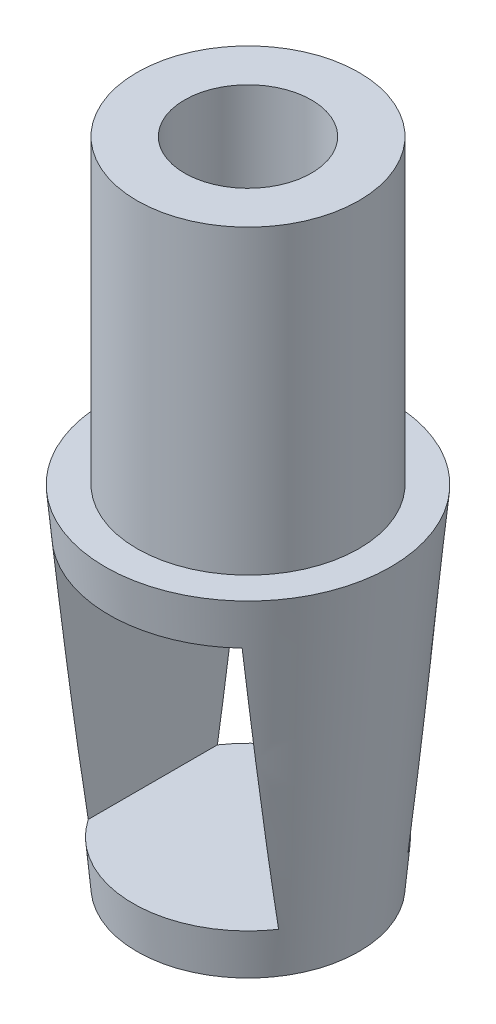
ISO-10303-21;
HEADER;
FILE_DESCRIPTION(('STEP AP214'),'2;1');
FILE_NAME('part.step','',(''),(''),'','','');
FILE_SCHEMA(('AUTOMOTIVE_DESIGN { 1 0 10303 214 1 1 1 1 }'));
ENDSEC;
DATA;
#1=APPLICATION_CONTEXT('core data for automotive mechanical design processes');
#2=APPLICATION_PROTOCOL_DEFINITION('international standard','automotive_design',2000,#1);
#3=PRODUCT_CONTEXT('',#1,'mechanical');
#4=PRODUCT('Part','Part','',(#3));
#5=PRODUCT_RELATED_PRODUCT_CATEGORY('part','',(#4));
#6=PRODUCT_DEFINITION_FORMATION('','',#4);
#7=PRODUCT_DEFINITION_CONTEXT('part definition',#1,'design');
#8=PRODUCT_DEFINITION('design','',#6,#7);
#9=PRODUCT_DEFINITION_SHAPE('','',#8);
#10=(LENGTH_UNIT() NAMED_UNIT(*) SI_UNIT(.MILLI.,.METRE.));
#11=(NAMED_UNIT(*) PLANE_ANGLE_UNIT() SI_UNIT($,.RADIAN.));
#12=(NAMED_UNIT(*) SI_UNIT($,.STERADIAN.) SOLID_ANGLE_UNIT());
#13=UNCERTAINTY_MEASURE_WITH_UNIT(LENGTH_MEASURE(1.E-05),#10,'distance_accuracy_value','');
#14=(GEOMETRIC_REPRESENTATION_CONTEXT(3) GLOBAL_UNCERTAINTY_ASSIGNED_CONTEXT((#13)) GLOBAL_UNIT_ASSIGNED_CONTEXT((#10,
#11,#12)) REPRESENTATION_CONTEXT('',''));
#15=CARTESIAN_POINT('',(0.,0.,0.));
#16=DIRECTION('',(0.,0.,1.));
#17=DIRECTION('',(1.,0.,0.));
#18=AXIS2_PLACEMENT_3D('',#15,#16,#17);
#19=CARTESIAN_POINT('',(0.,-22.,0.));
#20=DIRECTION('',(0.,1.,0.));
#21=DIRECTION('',(-1.,0.,0.));
#22=AXIS2_PLACEMENT_3D('',#19,#20,#21);
#23=PLANE('',#22);
#24=CARTESIAN_POINT('',(0.,-22.,0.));
#25=DIRECTION('',(0.,1.,0.));
#26=DIRECTION('',(-1.,0.,0.));
#27=AXIS2_PLACEMENT_3D('',#24,#25,#26);
#28=CIRCLE('',#27,7.);
#29=CARTESIAN_POINT('',(-7.,-22.,0.));
#30=VERTEX_POINT('',#29);
#31=EDGE_CURVE('E113',#30,#30,#28,.T.);
#32=ORIENTED_EDGE('',*,*,#31,.F.);
#33=EDGE_LOOP('',(#32));
#34=FACE_BOUND('',#33,.T.);
#35=ADVANCED_FACE('F39',(#34),#23,.F.);
#36=CARTESIAN_POINT('',(0.,-22.,0.));
#37=DIRECTION('',(0.,1.,0.));
#38=DIRECTION('',(-1.,0.,0.));
#39=AXIS2_PLACEMENT_3D('',#36,#37,#38);
#40=CONICAL_SURFACE('',#39,7.,0.0906598872007452);
#41=CARTESIAN_POINT('',(0.,-19.25,0.));
#42=DIRECTION('',(0.,-1.,0.));
#43=DIRECTION('',(0.,0.,-1.));
#44=AXIS2_PLACEMENT_3D('',#41,#42,#43);
#45=CIRCLE('',#44,7.25);
#46=CARTESIAN_POINT('',(-6.,-19.25,-4.06970514902493));
#47=VERTEX_POINT('',#46);
#48=CARTESIAN_POINT('',(6.,-19.25,-4.06970514902493));
#49=VERTEX_POINT('',#48);
#50=EDGE_CURVE('E52',#47,#49,#45,.T.);
#51=ORIENTED_EDGE('',*,*,#50,.T.);
#52=CARTESIAN_POINT('',(6.,-2.74929999999999,6.36895702924845));
#53=CARTESIAN_POINT('',(6.,-3.41157786192484,6.28623613697593));
#54=CARTESIAN_POINT('',(6.,-4.0737639269837,6.20277903288443));
#55=CARTESIAN_POINT('',(6.,-5.3979240031515,6.03418044636888));
#56=CARTESIAN_POINT('',(6.,-6.05989801346312,5.94903895768528));
#57=CARTESIAN_POINT('',(6.,-8.04559694126963,5.69075204212243));
#58=CARTESIAN_POINT('',(6.,-9.36895359432704,5.51476220239234));
#59=CARTESIAN_POINT('',(6.,-12.019282568322,5.15213850487161));
#60=CARTESIAN_POINT('',(6.,-13.346249803363,4.96546715528971));
#61=CARTESIAN_POINT('',(6.,-15.3351355936867,4.67497056708737));
#62=CARTESIAN_POINT('',(6.,-15.9978202457844,4.57639268817128));
#63=CARTESIAN_POINT('',(6.,-17.3225413479327,4.37498344986034));
#64=CARTESIAN_POINT('',(6.,-17.9845778013007,4.27215211235177));
#65=CARTESIAN_POINT('',(6.,-19.3072785696448,4.06134468215654));
#66=CARTESIAN_POINT('',(6.,-19.967943564382,3.95337287288708));
#67=CARTESIAN_POINT('',(6.,-21.2881968069699,3.73080510320076));
#68=CARTESIAN_POINT('',(6.,-21.9477849955678,3.61620879010885));
#69=CARTESIAN_POINT('',(6.,-23.2643888672432,3.37854709283215));
#70=CARTESIAN_POINT('',(6.,-23.9214069589679,3.25549521152295));
#71=CARTESIAN_POINT('',(6.,-24.9051342942861,3.06195112518811));
#72=CARTESIAN_POINT('',(6.,-25.2327260668337,2.99594580059214));
#73=CARTESIAN_POINT('',(6.,-25.8871543084975,2.86030009997771));
#74=CARTESIAN_POINT('',(6.,-26.2139907892526,2.79065978036928));
#75=CARTESIAN_POINT('',(6.,-26.8667004631996,2.64689409351386));
#76=CARTESIAN_POINT('',(6.,-27.1925735971368,2.57276845616035));
#77=CARTESIAN_POINT('',(6.,-27.8430478823879,2.41880587155663));
#78=CARTESIAN_POINT('',(6.,-28.1676487691075,2.33896779651065));
#79=CARTESIAN_POINT('',(6.,-28.8159728483708,2.17145995649624));
#80=CARTESIAN_POINT('',(6.,-29.1396896337184,2.08376527473112));
#81=CARTESIAN_POINT('',(6.,-29.7839860933867,1.8978286991293));
#82=CARTESIAN_POINT('',(6.00000000000001,-30.1045672686348,1.79959215113137));
#83=CARTESIAN_POINT('',(6.00000000000001,-30.5821914672678,1.63967118885288));
#84=CARTESIAN_POINT('',(6.00000000000001,-30.7412761235643,1.58410552032572));
#85=CARTESIAN_POINT('',(6.00000000000001,-31.0575918871342,1.46744653213443));
#86=CARTESIAN_POINT('',(6.00000000000001,-31.2148213039651,1.406348554146));
#87=CARTESIAN_POINT('',(6.00000000000001,-31.5253338429986,1.27697251772333));
#88=CARTESIAN_POINT('',(6.00000000000001,-31.67863345847,1.20873421101269));
#89=CARTESIAN_POINT('',(6.00000000000001,-31.9799074744141,1.06149636613106));
#90=CARTESIAN_POINT('',(6.00000000000001,-32.127891075645,0.982516677906375));
#91=CARTESIAN_POINT('',(6.00000000000001,-32.3383078650953,0.852720628920309));
#92=CARTESIAN_POINT('',(6.00000000000001,-32.4049627108245,0.808812198958892));
#93=CARTESIAN_POINT('',(6.00000000000001,-32.5344726282563,0.715410606815345));
#94=CARTESIAN_POINT('',(6.00000000000001,-32.5973235558198,0.665911516360918));
#95=CARTESIAN_POINT('',(6.00000000000001,-32.7029342276362,0.571384954380518));
#96=CARTESIAN_POINT('',(6.00000000000001,-32.7470278475958,0.527867688824986));
#97=CARTESIAN_POINT('',(6.00000000000001,-32.8286888686916,0.435042864570852));
#98=CARTESIAN_POINT('',(6.00000000000001,-32.866276337585,0.385753926329013));
#99=CARTESIAN_POINT('',(6.00000000000001,-32.9169770114221,0.302569984290009));
#100=CARTESIAN_POINT('',(6.00000000000001,-32.9337334237531,0.270924390627975));
#101=CARTESIAN_POINT('',(6.00000000000001,-32.9622928455412,0.205458990699502));
#102=CARTESIAN_POINT('',(6.00000000000001,-32.9741024599122,0.171642153523508));
#103=CARTESIAN_POINT('',(6.00000000000001,-32.9915853917568,0.101986499656772));
#104=CARTESIAN_POINT('',(6.00000000000001,-32.997186343342,0.0661288565779811));
#105=CARTESIAN_POINT('',(6.00000000000001,-33.0011557792697,-0.00598557723448762));
#106=CARTESIAN_POINT('',(6.00000000000001,-32.9995282067407,-0.0422421395942278));
#107=CARTESIAN_POINT('',(6.00000000000001,-32.9900016346548,-0.108971249552611));
#108=CARTESIAN_POINT('',(6.00000000000001,-32.9829622119818,-0.139573627735668));
#109=CARTESIAN_POINT('',(6.00000000000001,-32.9643932967254,-0.199371226856132));
#110=CARTESIAN_POINT('',(6.00000000000001,-32.9528607125466,-0.228565463320849));
#111=CARTESIAN_POINT('',(6.00000000000001,-32.9178285633561,-0.303025976250943));
#112=CARTESIAN_POINT('',(6.00000000000001,-32.8913607235488,-0.346882220532207));
#113=CARTESIAN_POINT('',(6.00000000000001,-32.8321916863204,-0.430157060314446));
#114=CARTESIAN_POINT('',(6.00000000000001,-32.7994701746349,-0.469560508684157));
#115=CARTESIAN_POINT('',(6.00000000000001,-32.7205586737434,-0.554752707799295));
#116=CARTESIAN_POINT('',(6.00000000000001,-32.6731239632975,-0.599370571702481));
#117=CARTESIAN_POINT('',(6.00000000000001,-32.5742084619371,-0.683932070191172));
#118=CARTESIAN_POINT('',(6.00000000000001,-32.5227198440629,-0.723866272766231));
#119=CARTESIAN_POINT('',(6.00000000000001,-32.4168282994722,-0.800275135265663));
#120=CARTESIAN_POINT('',(6.00000000000001,-32.3624107507736,-0.836729308745305));
#121=CARTESIAN_POINT('',(6.00000000000001,-32.2517934453364,-0.906665602261655));
#122=CARTESIAN_POINT('',(6.00000000000001,-32.1955954546985,-0.940150549609554));
#123=CARTESIAN_POINT('',(6.00000000000001,-32.027502401997,-1.03568589608355));
#124=CARTESIAN_POINT('',(6.00000000000001,-31.9137359320747,-1.09443243330031));
#125=CARTESIAN_POINT('',(6.00000000000001,-31.683191532179,-1.20573985987264));
#126=CARTESIAN_POINT('',(6.00000000000001,-31.5664114658135,-1.25829620536914));
#127=CARTESIAN_POINT('',(6.00000000000001,-31.3306223148068,-1.35889344684933));
#128=CARTESIAN_POINT('',(6.00000000000001,-31.2116087944306,-1.40692388450964));
#129=CARTESIAN_POINT('',(6.00000000000001,-30.9721848586101,-1.49938431393649));
#130=CARTESIAN_POINT('',(6.00000000000001,-30.8517742422687,-1.5438137803746));
#131=CARTESIAN_POINT('',(6.00000000000001,-30.4886298636029,-1.67295772576053));
#132=CARTESIAN_POINT('',(6.00000000000001,-30.2443690289647,-1.75336979857048));
#133=CARTESIAN_POINT('',(6.00000000000001,-29.7538159174057,-1.90621625434781));
#134=CARTESIAN_POINT('',(6.,-29.5075272221107,-1.97866238056993));
#135=CARTESIAN_POINT('',(6.,-29.016060319094,-2.11696085795093));
#136=CARTESIAN_POINT('',(6.,-28.7709001009231,-2.18287744042156));
#137=CARTESIAN_POINT('',(6.,-28.2794308416723,-2.31028468314236));
#138=CARTESIAN_POINT('',(6.,-28.0331217557226,-2.37177516896068));
#139=CARTESIAN_POINT('',(6.,-27.292825502795,-2.55098933758772));
#140=CARTESIAN_POINT('',(6.,-26.7975613135171,-2.66343066917876));
#141=CARTESIAN_POINT('',(6.,-25.8043537795619,-2.87874650657173));
#142=CARTESIAN_POINT('',(6.,-25.3064078832079,-2.98160903727526));
#143=CARTESIAN_POINT('',(6.,-24.3091351195651,-3.18008754912198));
#144=CARTESIAN_POINT('',(6.,-23.8098084051278,-3.27570430148908));
#145=CARTESIAN_POINT('',(6.,-22.8111951199479,-3.46114428114212));
#146=CARTESIAN_POINT('',(6.,-22.3119107634498,-3.5509795031266));
#147=CARTESIAN_POINT('',(6.,-21.3125483920742,-3.72618256137088));
#148=CARTESIAN_POINT('',(6.,-20.8124703569143,-3.81155028150715));
#149=CARTESIAN_POINT('',(6.,-19.3119099528939,-4.06209896602684));
#150=CARTESIAN_POINT('',(6.,-18.3105187875108,-4.22183143877735));
#151=CARTESIAN_POINT('',(6.,-16.0979128486086,-4.56314810496472));
#152=CARTESIAN_POINT('',(6.,-14.8863381490878,-4.74237559396403));
#153=CARTESIAN_POINT('',(6.,-12.4614046431944,-5.09018663846466));
#154=CARTESIAN_POINT('',(6.,-11.2480455078644,-5.25876788551415));
#155=CARTESIAN_POINT('',(6.,-8.82075375506325,-5.58783808782633));
#156=CARTESIAN_POINT('',(6.,-7.60682159266247,-5.74833041296926));
#157=CARTESIAN_POINT('',(6.,-5.78547412918668,-5.98436380789811));
#158=CARTESIAN_POINT('',(6.,-5.17836080495455,-6.06224780220427));
#159=CARTESIAN_POINT('',(6.,-3.96395753308428,-6.21661393845005));
#160=CARTESIAN_POINT('',(6.,-3.35666758591764,-6.29309608409767));
#161=CARTESIAN_POINT('',(6.,-2.7493,-6.36895702924845));
#162=B_SPLINE_CURVE_WITH_KNOTS('',3,(#52,#53,#54,#55,#56,#57,#58,#59,#60,#61,#62,#63,#64,#65,
#66,#67,#68,#69,#70,#71,#72,#73,#74,#75,#76,#77,#78,#79,#80,#81,#82,#83,#84,#85,#86,#87,#88,#89,
#90,#91,#92,#93,#94,#95,#96,#97,#98,#99,#100,#101,#102,#103,#104,#105,#106,#107,#108,#109,#110,
#111,#112,#113,#114,#115,#116,#117,#118,#119,#120,#121,#122,#123,#124,#125,#126,#127,#128,#129,
#130,#131,#132,#133,#134,#135,#136,#137,#138,#139,#140,#141,#142,#143,#144,#145,#146,#147,#148,
#149,#150,#151,#152,#153,#154,#155,#156,#157,#158,#159,#160,#161),.UNSPECIFIED.,.F.,.F.,(4,2,2,
2,2,2,2,2,2,2,2,2,2,2,2,2,2,2,2,2,2,2,2,2,2,2,2,2,2,2,2,2,2,2,2,2,2,2,2,2,2,2,2,2,2,2,2,2,2,2,2,
2,2,2,4),(0.,2.00227141781602,4.00455027792144,8.00954682480411,12.0295842665904,
14.0395031818071,16.0494117562171,18.0576738797896,20.0660430177747,22.0712763142118,
23.073786349132,24.0762808311185,25.0788357436687,26.081589137815,27.0876436098256,
28.0931902955854,28.5986538297231,29.1045470047974,29.6077601704495,30.1100557297279,
30.3493362778752,30.5888729816979,30.7743738371247,30.9592919178139,31.0664003310931,
31.1733652749177,31.2815642656778,31.3897042416098,31.4835150458311,31.5773905124775,
31.7301720320647,31.8834585481947,32.0783621451347,32.2736517362355,32.4700279817785,
32.6662151826262,33.0500089848731,33.4340827748453,33.8190233570732,34.2040199957338,
34.9752614997687,35.7453503634336,36.5068964154912,37.2684724635559,38.7919104166767,
40.317228046895,41.8423830971255,43.3642645585705,44.8861855585717,47.9282515721392,
51.6024663933073,55.2774751876247,58.9509400828472,60.7872047577453,62.6234645748718),.UNSPECIFIED.);
#163=CARTESIAN_POINT('',(6.,-2.75,-6.3688696014285));
#164=VERTEX_POINT('',#163);
#165=EDGE_CURVE('E11',#49,#164,#162,.T.);
#166=ORIENTED_EDGE('',*,*,#165,.T.);
#167=CARTESIAN_POINT('',(0.,-2.75,0.));
#168=DIRECTION('',(0.,1.,0.));
#169=DIRECTION('',(0.,0.,1.));
#170=AXIS2_PLACEMENT_3D('',#167,#168,#169);
#171=CIRCLE('',#170,8.75);
#172=CARTESIAN_POINT('',(-6.,-2.75,-6.36886960142849));
#173=VERTEX_POINT('',#172);
#174=EDGE_CURVE('E90',#164,#173,#171,.T.);
#175=ORIENTED_EDGE('',*,*,#174,.T.);
#176=CARTESIAN_POINT('',(-6.,-2.7493,-6.36895702924845));
#177=CARTESIAN_POINT('',(-6.,-3.41157786192484,-6.28623613697593));
#178=CARTESIAN_POINT('',(-6.,-4.0737639269837,-6.20277903288443));
#179=CARTESIAN_POINT('',(-6.,-5.3979240031515,-6.03418044636888));
#180=CARTESIAN_POINT('',(-6.,-6.05989801346312,-5.94903895768527));
#181=CARTESIAN_POINT('',(-6.,-8.04559694126963,-5.69075204212243));
#182=CARTESIAN_POINT('',(-6.,-9.36895359432704,-5.51476220239234));
#183=CARTESIAN_POINT('',(-6.,-12.019282568322,-5.15213850487161));
#184=CARTESIAN_POINT('',(-6.,-13.346249803363,-4.96546715528971));
#185=CARTESIAN_POINT('',(-6.,-15.3351355936867,-4.67497056708737));
#186=CARTESIAN_POINT('',(-6.,-15.9978202457844,-4.57639268817128));
#187=CARTESIAN_POINT('',(-6.,-17.3225413479327,-4.37498344986034));
#188=CARTESIAN_POINT('',(-6.,-17.9845778013007,-4.27215211235177));
#189=CARTESIAN_POINT('',(-6.,-19.3072785696448,-4.06134468215654));
#190=CARTESIAN_POINT('',(-6.,-19.967943564382,-3.95337287288708));
#191=CARTESIAN_POINT('',(-6.,-21.2881968069699,-3.73080510320076));
#192=CARTESIAN_POINT('',(-6.,-21.9477849955678,-3.61620879010885));
#193=CARTESIAN_POINT('',(-6.,-23.2643888672432,-3.37854709283215));
#194=CARTESIAN_POINT('',(-6.,-23.9214069589679,-3.25549521152296));
#195=CARTESIAN_POINT('',(-6.,-24.9051342942861,-3.06195112518811));
#196=CARTESIAN_POINT('',(-6.,-25.2327260668337,-2.99594580059215));
#197=CARTESIAN_POINT('',(-6.,-25.8871543084975,-2.86030009997771));
#198=CARTESIAN_POINT('',(-6.,-26.2139907892526,-2.79065978036929));
#199=CARTESIAN_POINT('',(-6.,-26.8667004631996,-2.64689409351386));
#200=CARTESIAN_POINT('',(-6.,-27.1925735971368,-2.57276845616036));
#201=CARTESIAN_POINT('',(-6.,-27.8430478823879,-2.41880587155663));
#202=CARTESIAN_POINT('',(-6.,-28.1676487691075,-2.33896779651066));
#203=CARTESIAN_POINT('',(-6.,-28.8159728483708,-2.17145995649624));
#204=CARTESIAN_POINT('',(-6.,-29.1396896337184,-2.08376527473112));
#205=CARTESIAN_POINT('',(-6.,-29.7839860933867,-1.89782869912931));
#206=CARTESIAN_POINT('',(-6.,-30.1045672686348,-1.79959215113138));
#207=CARTESIAN_POINT('',(-6.,-30.5821914672678,-1.63967118885289));
#208=CARTESIAN_POINT('',(-6.,-30.7412761235643,-1.58410552032572));
#209=CARTESIAN_POINT('',(-6.,-31.0575918871342,-1.46744653213443));
#210=CARTESIAN_POINT('',(-6.,-31.2148213039651,-1.406348554146));
#211=CARTESIAN_POINT('',(-6.,-31.5253338429986,-1.27697251772333));
#212=CARTESIAN_POINT('',(-6.,-31.67863345847,-1.2087342110127));
#213=CARTESIAN_POINT('',(-6.,-31.9799074744141,-1.06149636613106));
#214=CARTESIAN_POINT('',(-6.,-32.127891075645,-0.982516677906385));
#215=CARTESIAN_POINT('',(-6.,-32.3383078650953,-0.852720628920324));
#216=CARTESIAN_POINT('',(-6.,-32.4049627108246,-0.808812198958909));
#217=CARTESIAN_POINT('',(-6.,-32.5344726282563,-0.715410606815358));
#218=CARTESIAN_POINT('',(-6.,-32.5973235558199,-0.665911516360926));
#219=CARTESIAN_POINT('',(-6.,-32.7029342276362,-0.57138495438052));
#220=CARTESIAN_POINT('',(-6.,-32.7470278475959,-0.52786768882499));
#221=CARTESIAN_POINT('',(-6.,-32.8286888686916,-0.435042864570859));
#222=CARTESIAN_POINT('',(-6.,-32.866276337585,-0.385753926329021));
#223=CARTESIAN_POINT('',(-6.,-32.9169770114221,-0.302569984290016));
#224=CARTESIAN_POINT('',(-6.,-32.9337334237531,-0.27092439062798));
#225=CARTESIAN_POINT('',(-6.,-32.9622928455412,-0.205458990699506));
#226=CARTESIAN_POINT('',(-6.,-32.9741024599122,-0.171642153523513));
#227=CARTESIAN_POINT('',(-6.,-32.9915853917568,-0.101986499656777));
#228=CARTESIAN_POINT('',(-5.99999999999999,-32.997186343342,-0.066128856577986));
#229=CARTESIAN_POINT('',(-5.99999999999999,-33.0011557792697,0.00598557723448356));
#230=CARTESIAN_POINT('',(-6.,-32.9995282067408,0.0422421395942247));
#231=CARTESIAN_POINT('',(-6.,-32.9900016346548,0.108971249552608));
#232=CARTESIAN_POINT('',(-6.,-32.9829622119818,0.139573627735663));
#233=CARTESIAN_POINT('',(-6.,-32.9643932967255,0.199371226856128));
#234=CARTESIAN_POINT('',(-6.,-32.9528607125466,0.228565463320847));
#235=CARTESIAN_POINT('',(-6.,-32.9178285633561,0.303025976250944));
#236=CARTESIAN_POINT('',(-6.,-32.8913607235489,0.346882220532209));
#237=CARTESIAN_POINT('',(-6.,-32.8321916863204,0.430157060314446));
#238=CARTESIAN_POINT('',(-6.,-32.7994701746349,0.469560508684153));
#239=CARTESIAN_POINT('',(-6.,-32.7205586737434,0.55475270779929));
#240=CARTESIAN_POINT('',(-6.,-32.6731239632976,0.599370571702482));
#241=CARTESIAN_POINT('',(-6.,-32.5742084619372,0.683932070191177));
#242=CARTESIAN_POINT('',(-6.,-32.5227198440629,0.723866272766234));
#243=CARTESIAN_POINT('',(-6.,-32.4168282994722,0.800275135265665));
#244=CARTESIAN_POINT('',(-6.,-32.3624107507736,0.836729308745308));
#245=CARTESIAN_POINT('',(-6.,-32.2517934453364,0.906665602261655));
#246=CARTESIAN_POINT('',(-6.,-32.1955954546986,0.94015054960955));
#247=CARTESIAN_POINT('',(-6.,-32.027502401997,1.03568589608354));
#248=CARTESIAN_POINT('',(-6.,-31.9137359320747,1.0944324333003));
#249=CARTESIAN_POINT('',(-6.,-31.6831915321791,1.20573985987263));
#250=CARTESIAN_POINT('',(-6.,-31.5664114658136,1.25829620536913));
#251=CARTESIAN_POINT('',(-6.,-31.3306223148068,1.35889344684931));
#252=CARTESIAN_POINT('',(-6.,-31.2116087944307,1.40692388450962));
#253=CARTESIAN_POINT('',(-6.,-30.9721848586102,1.49938431393647));
#254=CARTESIAN_POINT('',(-6.,-30.8517742422688,1.54381378037458));
#255=CARTESIAN_POINT('',(-6.,-30.488629863603,1.67295772576051));
#256=CARTESIAN_POINT('',(-6.,-30.2443690289648,1.75336979857046));
#257=CARTESIAN_POINT('',(-6.,-29.7538159174058,1.90621625434779));
#258=CARTESIAN_POINT('',(-6.,-29.5075272221108,1.97866238056991));
#259=CARTESIAN_POINT('',(-6.,-29.0160603190942,2.11696085795091));
#260=CARTESIAN_POINT('',(-6.,-28.7709001009232,2.18287744042154));
#261=CARTESIAN_POINT('',(-6.,-28.2794308416724,2.31028468314233));
#262=CARTESIAN_POINT('',(-6.,-28.0331217557227,2.37177516896065));
#263=CARTESIAN_POINT('',(-6.,-27.2928255027951,2.55098933758769));
#264=CARTESIAN_POINT('',(-6.,-26.7975613135172,2.66343066917873));
#265=CARTESIAN_POINT('',(-6.,-25.804353779562,2.8787465065717));
#266=CARTESIAN_POINT('',(-6.,-25.306407883208,2.98160903727524));
#267=CARTESIAN_POINT('',(-6.,-24.3091351195652,3.18008754912196));
#268=CARTESIAN_POINT('',(-6.,-23.809808405128,3.27570430148906));
#269=CARTESIAN_POINT('',(-6.,-22.8111951199481,3.46114428114209));
#270=CARTESIAN_POINT('',(-6.,-22.31191076345,3.55097950312657));
#271=CARTESIAN_POINT('',(-6.,-21.3125483920744,3.72618256137084));
#272=CARTESIAN_POINT('',(-6.,-20.8124703569145,3.81155028150711));
#273=CARTESIAN_POINT('',(-6.,-19.3119099528941,4.0620989660268));
#274=CARTESIAN_POINT('',(-6.,-18.3105187875111,4.22183143877731));
#275=CARTESIAN_POINT('',(-6.,-16.0979128486089,4.56314810496467));
#276=CARTESIAN_POINT('',(-6.,-14.8863381490881,4.74237559396399));
#277=CARTESIAN_POINT('',(-6.,-12.4614046431947,5.09018663846462));
#278=CARTESIAN_POINT('',(-6.,-11.2480455078647,5.25876788551412));
#279=CARTESIAN_POINT('',(-6.,-8.82075375506341,5.58783808782631));
#280=CARTESIAN_POINT('',(-6.,-7.60682159266259,5.74833041296924));
#281=CARTESIAN_POINT('',(-6.,-5.78547412918675,5.98436380789809));
#282=CARTESIAN_POINT('',(-6.,-5.17836080495461,6.06224780220426));
#283=CARTESIAN_POINT('',(-6.,-3.96395753308432,6.21661393845004));
#284=CARTESIAN_POINT('',(-6.,-3.35666758591765,6.29309608409766));
#285=CARTESIAN_POINT('',(-6.,-2.7493,6.36895702924845));
#286=B_SPLINE_CURVE_WITH_KNOTS('',3,(#176,#177,#178,#179,#180,#181,#182,#183,#184,#185,#186,
#187,#188,#189,#190,#191,#192,#193,#194,#195,#196,#197,#198,#199,#200,#201,#202,#203,#204,#205,
#206,#207,#208,#209,#210,#211,#212,#213,#214,#215,#216,#217,#218,#219,#220,#221,#222,#223,#224,
#225,#226,#227,#228,#229,#230,#231,#232,#233,#234,#235,#236,#237,#238,#239,#240,#241,#242,#243,
#244,#245,#246,#247,#248,#249,#250,#251,#252,#253,#254,#255,#256,#257,#258,#259,#260,#261,#262,
#263,#264,#265,#266,#267,#268,#269,#270,#271,#272,#273,#274,#275,#276,#277,#278,#279,#280,#281,
#282,#283,#284,#285),.UNSPECIFIED.,.F.,.F.,(4,2,2,2,2,2,2,2,2,2,2,2,2,2,2,2,2,2,2,2,2,2,2,2,2,2,
2,2,2,2,2,2,2,2,2,2,2,2,2,2,2,2,2,2,2,2,2,2,2,2,2,2,2,2,4),(0.,2.00227141781602,
4.00455027792144,8.00954682480411,12.0295842665904,14.0395031818071,16.0494117562171,
18.0576738797896,20.0660430177747,22.0712763142118,23.073786349132,24.0762808311185,
25.0788357436687,26.081589137815,27.0876436098256,28.0931902955854,28.5986538297231,
29.1045470047974,29.6077601704495,30.1100557297279,30.3493362778751,30.5888729816979,
30.7743738371247,30.9592919178139,31.0664003310931,31.1733652749177,31.2815642656778,
31.3897042416098,31.4835150458311,31.5773905124775,31.7301720320647,31.8834585481947,
32.0783621451347,32.2736517362356,32.4700279817785,32.6662151826262,33.0500089848731,
33.4340827748452,33.8190233570731,34.2040199957337,34.9752614997687,35.7453503634336,
36.5068964154911,37.2684724635558,38.7919104166766,40.3172280468949,41.8423830971254,
43.3642645585703,44.8861855585715,47.9282515721389,51.6024663933071,55.2774751876245,
58.9509400828471,60.7872047577453,62.6234645748718),.UNSPECIFIED.);
#287=EDGE_CURVE('E96',#173,#47,#286,.T.);
#288=ORIENTED_EDGE('',*,*,#287,.T.);
#289=EDGE_LOOP('',(#51,#166,#175,#288));
#290=FACE_BOUND('',#289,.T.);
#291=CARTESIAN_POINT('',(-6.,-2.75,6.3688696014285));
#292=VERTEX_POINT('',#291);
#293=CARTESIAN_POINT('',(6.,-2.75,6.36886960142851));
#294=VERTEX_POINT('',#293);
#295=EDGE_CURVE('E82',#292,#294,#171,.T.);
#296=ORIENTED_EDGE('',*,*,#295,.T.);
#297=CARTESIAN_POINT('',(6.,-19.25,4.06970514902493));
#298=VERTEX_POINT('',#297);
#299=EDGE_CURVE('E42',#294,#298,#162,.T.);
#300=ORIENTED_EDGE('',*,*,#299,.T.);
#301=CARTESIAN_POINT('',(-6.,-19.25,4.06970514902493));
#302=VERTEX_POINT('',#301);
#303=EDGE_CURVE('E103',#298,#302,#45,.T.);
#304=ORIENTED_EDGE('',*,*,#303,.T.);
#305=EDGE_CURVE('E87',#302,#292,#286,.T.);
#306=ORIENTED_EDGE('',*,*,#305,.T.);
#307=EDGE_LOOP('',(#296,#300,#304,#306));
#308=FACE_BOUND('',#307,.T.);
#309=CARTESIAN_POINT('',(0.,0.,0.));
#310=DIRECTION('',(0.,1.,0.));
#311=DIRECTION('',(-1.,0.,0.));
#312=AXIS2_PLACEMENT_3D('',#309,#310,#311);
#313=CIRCLE('',#312,9.);
#314=CARTESIAN_POINT('',(-9.,0.,0.));
#315=VERTEX_POINT('',#314);
#316=EDGE_CURVE('E116',#315,#315,#313,.T.);
#317=ORIENTED_EDGE('',*,*,#316,.F.);
#318=EDGE_LOOP('',(#317));
#319=FACE_BOUND('',#318,.T.);
#320=ORIENTED_EDGE('',*,*,#31,.T.);
#321=EDGE_LOOP('',(#320));
#322=FACE_BOUND('',#321,.T.);
#323=ADVANCED_FACE('F101',(#290,#308,#319,#322),#40,.T.);
#324=CARTESIAN_POINT('',(0.,0.,0.));
#325=DIRECTION('',(0.,-1.,0.));
#326=DIRECTION('',(1.,0.,0.));
#327=AXIS2_PLACEMENT_3D('',#324,#325,#326);
#328=PLANE('',#327);
#329=CARTESIAN_POINT('',(0.,0.,0.));
#330=DIRECTION('',(0.,1.,0.));
#331=DIRECTION('',(-1.,0.,0.));
#332=AXIS2_PLACEMENT_3D('',#329,#330,#331);
#333=CIRCLE('',#332,7.);
#334=CARTESIAN_POINT('',(-7.,0.,0.));
#335=VERTEX_POINT('',#334);
#336=EDGE_CURVE('E88',#335,#335,#333,.T.);
#337=ORIENTED_EDGE('',*,*,#336,.F.);
#338=EDGE_LOOP('',(#337));
#339=FACE_BOUND('',#338,.T.);
#340=ORIENTED_EDGE('',*,*,#316,.T.);
#341=EDGE_LOOP('',(#340));
#342=FACE_BOUND('',#341,.T.);
#343=ADVANCED_FACE('F140',(#339,#342),#328,.F.);
#344=CARTESIAN_POINT('',(0.,19.,0.));
#345=DIRECTION('',(0.,-1.,0.));
#346=DIRECTION('',(1.,0.,0.));
#347=AXIS2_PLACEMENT_3D('',#344,#345,#346);
#348=CYLINDRICAL_SURFACE('',#347,7.);
#349=CARTESIAN_POINT('',(0.,19.,0.));
#350=DIRECTION('',(0.,1.,0.));
#351=DIRECTION('',(-1.,0.,0.));
#352=AXIS2_PLACEMENT_3D('',#349,#350,#351);
#353=CIRCLE('',#352,7.);
#354=CARTESIAN_POINT('',(-7.,19.,0.));
#355=VERTEX_POINT('',#354);
#356=EDGE_CURVE('E119',#355,#355,#353,.T.);
#357=ORIENTED_EDGE('',*,*,#356,.F.);
#358=EDGE_LOOP('',(#357));
#359=FACE_BOUND('',#358,.T.);
#360=ORIENTED_EDGE('',*,*,#336,.T.);
#361=EDGE_LOOP('',(#360));
#362=FACE_BOUND('',#361,.T.);
#363=ADVANCED_FACE('F146',(#359,#362),#348,.T.);
#364=CARTESIAN_POINT('',(0.,19.,0.));
#365=DIRECTION('',(0.,1.,0.));
#366=DIRECTION('',(-1.,0.,0.));
#367=AXIS2_PLACEMENT_3D('',#364,#365,#366);
#368=PLANE('',#367);
#369=CARTESIAN_POINT('',(0.,19.,0.));
#370=DIRECTION('',(0.,1.,0.));
#371=DIRECTION('',(-1.,0.,0.));
#372=AXIS2_PLACEMENT_3D('',#369,#370,#371);
#373=CIRCLE('',#372,4.);
#374=CARTESIAN_POINT('',(-4.,19.,0.));
#375=VERTEX_POINT('',#374);
#376=EDGE_CURVE('E125',#375,#375,#373,.T.);
#377=ORIENTED_EDGE('',*,*,#376,.F.);
#378=EDGE_LOOP('',(#377));
#379=FACE_BOUND('',#378,.T.);
#380=ORIENTED_EDGE('',*,*,#356,.T.);
#381=EDGE_LOOP('',(#380));
#382=FACE_BOUND('',#381,.T.);
#383=ADVANCED_FACE('F156',(#379,#382),#368,.T.);
#384=CARTESIAN_POINT('',(0.,0.,0.));
#385=DIRECTION('',(0.,1.,0.));
#386=DIRECTION('',(-1.,0.,0.));
#387=AXIS2_PLACEMENT_3D('',#384,#385,#386);
#388=CYLINDRICAL_SURFACE('',#387,4.);
#389=CARTESIAN_POINT('',(0.,0.,0.));
#390=DIRECTION('',(0.,1.,0.));
#391=DIRECTION('',(-1.,0.,0.));
#392=AXIS2_PLACEMENT_3D('',#389,#390,#391);
#393=CIRCLE('',#392,4.);
#394=CARTESIAN_POINT('',(-4.,0.,0.));
#395=VERTEX_POINT('',#394);
#396=EDGE_CURVE('E124',#395,#395,#393,.T.);
#397=ORIENTED_EDGE('',*,*,#396,.F.);
#398=EDGE_LOOP('',(#397));
#399=FACE_BOUND('',#398,.T.);
#400=ORIENTED_EDGE('',*,*,#376,.T.);
#401=EDGE_LOOP('',(#400));
#402=FACE_BOUND('',#401,.T.);
#403=ADVANCED_FACE('F160',(#399,#402),#388,.F.);
#404=CARTESIAN_POINT('',(0.,0.,0.));
#405=DIRECTION('',(0.,1.,0.));
#406=DIRECTION('',(-1.,0.,0.));
#407=AXIS2_PLACEMENT_3D('',#404,#405,#406);
#408=PLANE('',#407);
#409=ORIENTED_EDGE('',*,*,#396,.T.);
#410=EDGE_LOOP('',(#409));
#411=FACE_BOUND('',#410,.T.);
#412=ADVANCED_FACE('F164',(#411),#408,.T.);
#413=CARTESIAN_POINT('',(6.,-2.75,-9.));
#414=DIRECTION('',(1.,0.,0.));
#415=DIRECTION('',(0.,1.,0.));
#416=AXIS2_PLACEMENT_3D('',#413,#414,#415);
#417=PLANE('',#416);
#418=DIRECTION('',(0.,0.,1.));
#419=VECTOR('',#418,1.);
#420=CARTESIAN_POINT('',(6.,-2.75,-9.));
#421=LINE('',#420,#419);
#422=EDGE_CURVE('E64',#164,#294,#421,.T.);
#423=ORIENTED_EDGE('',*,*,#422,.F.);
#424=ORIENTED_EDGE('',*,*,#165,.F.);
#425=DIRECTION('',(0.,0.,1.));
#426=VECTOR('',#425,1.);
#427=CARTESIAN_POINT('',(6.,-19.25,-9.));
#428=LINE('',#427,#426);
#429=EDGE_CURVE('E128',#49,#298,#428,.T.);
#430=ORIENTED_EDGE('',*,*,#429,.T.);
#431=ORIENTED_EDGE('',*,*,#299,.F.);
#432=EDGE_LOOP('',(#423,#424,#430,#431));
#433=FACE_BOUND('',#432,.T.);
#434=ADVANCED_FACE('F136',(#433),#417,.F.);
#435=CARTESIAN_POINT('',(-6.,-19.25,-9.));
#436=DIRECTION('',(0.,-1.,0.));
#437=DIRECTION('',(0.,0.,-1.));
#438=AXIS2_PLACEMENT_3D('',#435,#436,#437);
#439=PLANE('',#438);
#440=ORIENTED_EDGE('',*,*,#429,.F.);
#441=ORIENTED_EDGE('',*,*,#50,.F.);
#442=DIRECTION('',(0.,0.,1.));
#443=VECTOR('',#442,1.);
#444=CARTESIAN_POINT('',(-6.,-19.25,-9.));
#445=LINE('',#444,#443);
#446=EDGE_CURVE('E98',#47,#302,#445,.T.);
#447=ORIENTED_EDGE('',*,*,#446,.T.);
#448=ORIENTED_EDGE('',*,*,#303,.F.);
#449=EDGE_LOOP('',(#440,#441,#447,#448));
#450=FACE_BOUND('',#449,.T.);
#451=ADVANCED_FACE('F138',(#450),#439,.F.);
#452=CARTESIAN_POINT('',(-6.,-2.75,-9.));
#453=DIRECTION('',(-1.,0.,0.));
#454=DIRECTION('',(0.,-1.,0.));
#455=AXIS2_PLACEMENT_3D('',#452,#453,#454);
#456=PLANE('',#455);
#457=DIRECTION('',(0.,0.,1.));
#458=VECTOR('',#457,1.);
#459=CARTESIAN_POINT('',(-6.,-2.75,-9.));
#460=LINE('',#459,#458);
#461=EDGE_CURVE('E59',#173,#292,#460,.T.);
#462=ORIENTED_EDGE('',*,*,#461,.T.);
#463=ORIENTED_EDGE('',*,*,#305,.F.);
#464=ORIENTED_EDGE('',*,*,#446,.F.);
#465=ORIENTED_EDGE('',*,*,#287,.F.);
#466=EDGE_LOOP('',(#462,#463,#464,#465));
#467=FACE_BOUND('',#466,.T.);
#468=ADVANCED_FACE('F92',(#467),#456,.F.);
#469=CARTESIAN_POINT('',(-6.,-2.75,-9.));
#470=DIRECTION('',(0.,1.,0.));
#471=DIRECTION('',(0.,0.,1.));
#472=AXIS2_PLACEMENT_3D('',#469,#470,#471);
#473=PLANE('',#472);
#474=ORIENTED_EDGE('',*,*,#422,.T.);
#475=ORIENTED_EDGE('',*,*,#295,.F.);
#476=ORIENTED_EDGE('',*,*,#461,.F.);
#477=ORIENTED_EDGE('',*,*,#174,.F.);
#478=EDGE_LOOP('',(#474,#475,#476,#477));
#479=FACE_BOUND('',#478,.T.);
#480=ADVANCED_FACE('F83',(#479),#473,.F.);
#481=CLOSED_SHELL('',(#35,#323,#343,#363,#383,#403,#412,#434,#451,#468,#480));
#482=MANIFOLD_SOLID_BREP('B2',#481);
#483=ADVANCED_BREP_SHAPE_REPRESENTATION('',(#18,#482),#14);
#484=SHAPE_DEFINITION_REPRESENTATION(#9,#483);
ENDSEC;
END-ISO-10303-21;
